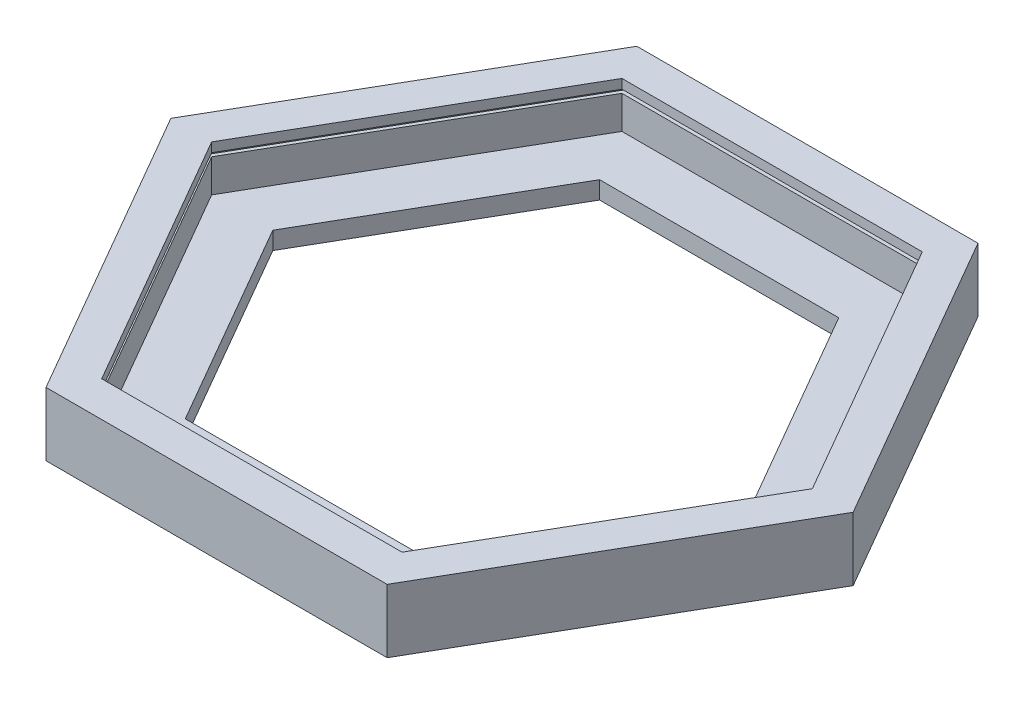
ISO-10303-21;
HEADER;
FILE_DESCRIPTION(('STEP AP214'),'2;1');
FILE_NAME('part.step','',(''),(''),'','','');
FILE_SCHEMA(('AUTOMOTIVE_DESIGN { 1 0 10303 214 1 1 1 1 }'));
ENDSEC;
DATA;
#1=APPLICATION_CONTEXT('core data for automotive mechanical design processes');
#2=APPLICATION_PROTOCOL_DEFINITION('international standard','automotive_design',2000,#1);
#3=PRODUCT_CONTEXT('',#1,'mechanical');
#4=PRODUCT('Part','Part','',(#3));
#5=PRODUCT_RELATED_PRODUCT_CATEGORY('part','',(#4));
#6=PRODUCT_DEFINITION_FORMATION('','',#4);
#7=PRODUCT_DEFINITION_CONTEXT('part definition',#1,'design');
#8=PRODUCT_DEFINITION('design','',#6,#7);
#9=PRODUCT_DEFINITION_SHAPE('','',#8);
#10=(LENGTH_UNIT() NAMED_UNIT(*) SI_UNIT(.MILLI.,.METRE.));
#11=(NAMED_UNIT(*) PLANE_ANGLE_UNIT() SI_UNIT($,.RADIAN.));
#12=(NAMED_UNIT(*) SI_UNIT($,.STERADIAN.) SOLID_ANGLE_UNIT());
#13=UNCERTAINTY_MEASURE_WITH_UNIT(LENGTH_MEASURE(1.E-05),#10,'distance_accuracy_value','');
#14=(GEOMETRIC_REPRESENTATION_CONTEXT(3) GLOBAL_UNCERTAINTY_ASSIGNED_CONTEXT((#13)) GLOBAL_UNIT_ASSIGNED_CONTEXT((#10,
#11,#12)) REPRESENTATION_CONTEXT('',''));
#15=CARTESIAN_POINT('',(0.,0.,0.));
#16=DIRECTION('',(0.,0.,1.));
#17=DIRECTION('',(1.,0.,0.));
#18=AXIS2_PLACEMENT_3D('',#15,#16,#17);
#19=CARTESIAN_POINT('',(-63.789419175,18.,36.8288383321362));
#20=DIRECTION('',(0.866025403784438,0.,-0.500000000000001));
#21=DIRECTION('',(-0.500000000000001,0.,-0.866025403784438));
#22=AXIS2_PLACEMENT_3D('',#19,#20,#21);
#23=PLANE('',#22);
#24=DIRECTION('',(0.,-1.,0.));
#25=VECTOR('',#24,1.);
#26=CARTESIAN_POINT('',(-85.0525589,18.,0.));
#27=LINE('',#26,#25);
#28=CARTESIAN_POINT('',(-85.0525589,14.35,0.));
#29=VERTEX_POINT('',#28);
#30=CARTESIAN_POINT('',(-85.0525589,5.,0.));
#31=VERTEX_POINT('',#30);
#32=EDGE_CURVE('E272',#29,#31,#27,.T.);
#33=ORIENTED_EDGE('',*,*,#32,.F.);
#34=DIRECTION('',(0.5,0.,0.866025403784439));
#35=VECTOR('',#34,1.);
#36=CARTESIAN_POINT('',(-85.0525589,14.35,0.));
#37=LINE('',#36,#35);
#38=CARTESIAN_POINT('',(-42.52627945,14.35,73.6576766642723));
#39=VERTEX_POINT('',#38);
#40=EDGE_CURVE('E479',#29,#39,#37,.T.);
#41=ORIENTED_EDGE('',*,*,#40,.T.);
#42=DIRECTION('',(0.,-1.,0.));
#43=VECTOR('',#42,1.);
#44=CARTESIAN_POINT('',(-42.5262794499999,18.,73.6576766642723));
#45=LINE('',#44,#43);
#46=CARTESIAN_POINT('',(-42.5262794499999,5.,73.6576766642723));
#47=VERTEX_POINT('',#46);
#48=EDGE_CURVE('E474',#39,#47,#45,.T.);
#49=ORIENTED_EDGE('',*,*,#48,.T.);
#50=DIRECTION('',(-0.500000000000001,0.,-0.866025403784438));
#51=VECTOR('',#50,1.);
#52=CARTESIAN_POINT('',(-63.789419175,5.,36.8288383321362));
#53=LINE('',#52,#51);
#54=EDGE_CURVE('E291',#47,#31,#53,.T.);
#55=ORIENTED_EDGE('',*,*,#54,.T.);
#56=EDGE_LOOP('',(#33,#41,#49,#55));
#57=FACE_BOUND('',#56,.T.);
#58=ADVANCED_FACE('F39',(#57),#23,.T.);
#59=CARTESIAN_POINT('',(-63.789419175,18.,-36.8288383321361));
#60=DIRECTION('',(0.866025403784439,0.,0.5));
#61=DIRECTION('',(0.5,0.,-0.866025403784439));
#62=AXIS2_PLACEMENT_3D('',#59,#60,#61);
#63=PLANE('',#62);
#64=DIRECTION('',(0.,-1.,0.));
#65=VECTOR('',#64,1.);
#66=CARTESIAN_POINT('',(-42.52627945,18.,-73.6576766642723));
#67=LINE('',#66,#65);
#68=CARTESIAN_POINT('',(-42.52627945,14.35,-73.6576766642723));
#69=VERTEX_POINT('',#68);
#70=CARTESIAN_POINT('',(-42.52627945,5.,-73.6576766642723));
#71=VERTEX_POINT('',#70);
#72=EDGE_CURVE('E268',#69,#71,#67,.T.);
#73=ORIENTED_EDGE('',*,*,#72,.F.);
#74=DIRECTION('',(-0.5,0.,0.866025403784439));
#75=VECTOR('',#74,1.);
#76=CARTESIAN_POINT('',(-42.52627945,14.35,-73.6576766642723));
#77=LINE('',#76,#75);
#78=EDGE_CURVE('E502',#69,#29,#77,.T.);
#79=ORIENTED_EDGE('',*,*,#78,.T.);
#80=ORIENTED_EDGE('',*,*,#32,.T.);
#81=DIRECTION('',(0.5,0.,-0.866025403784439));
#82=VECTOR('',#81,1.);
#83=CARTESIAN_POINT('',(-63.789419175,5.,-36.8288383321361));
#84=LINE('',#83,#82);
#85=EDGE_CURVE('E288',#31,#71,#84,.T.);
#86=ORIENTED_EDGE('',*,*,#85,.T.);
#87=EDGE_LOOP('',(#73,#79,#80,#86));
#88=FACE_BOUND('',#87,.T.);
#89=ADVANCED_FACE('F406',(#88),#63,.T.);
#90=CARTESIAN_POINT('',(0.,18.,-73.6576766642723));
#91=DIRECTION('',(0.,0.,1.));
#92=DIRECTION('',(1.,0.,0.));
#93=AXIS2_PLACEMENT_3D('',#90,#91,#92);
#94=PLANE('',#93);
#95=DIRECTION('',(0.,-1.,0.));
#96=VECTOR('',#95,1.);
#97=CARTESIAN_POINT('',(42.52627945,18.,-73.6576766642723));
#98=LINE('',#97,#96);
#99=CARTESIAN_POINT('',(42.52627945,14.35,-73.6576766642723));
#100=VERTEX_POINT('',#99);
#101=CARTESIAN_POINT('',(42.52627945,5.,-73.6576766642723));
#102=VERTEX_POINT('',#101);
#103=EDGE_CURVE('E260',#100,#102,#98,.T.);
#104=ORIENTED_EDGE('',*,*,#103,.F.);
#105=DIRECTION('',(-1.,0.,0.));
#106=VECTOR('',#105,1.);
#107=CARTESIAN_POINT('',(42.52627945,14.35,-73.6576766642723));
#108=LINE('',#107,#106);
#109=EDGE_CURVE('E499',#100,#69,#108,.T.);
#110=ORIENTED_EDGE('',*,*,#109,.T.);
#111=ORIENTED_EDGE('',*,*,#72,.T.);
#112=DIRECTION('',(1.,0.,0.));
#113=VECTOR('',#112,1.);
#114=CARTESIAN_POINT('',(0.,5.,-73.6576766642723));
#115=LINE('',#114,#113);
#116=EDGE_CURVE('E285',#71,#102,#115,.T.);
#117=ORIENTED_EDGE('',*,*,#116,.T.);
#118=EDGE_LOOP('',(#104,#110,#111,#117));
#119=FACE_BOUND('',#118,.T.);
#120=ADVANCED_FACE('F414',(#119),#94,.T.);
#121=CARTESIAN_POINT('',(63.789419175,18.,-36.8288383321362));
#122=DIRECTION('',(-0.866025403784438,0.,0.5));
#123=DIRECTION('',(0.5,0.,0.866025403784438));
#124=AXIS2_PLACEMENT_3D('',#121,#122,#123);
#125=PLANE('',#124);
#126=DIRECTION('',(0.,-1.,0.));
#127=VECTOR('',#126,1.);
#128=CARTESIAN_POINT('',(85.0525589,18.,0.));
#129=LINE('',#128,#127);
#130=CARTESIAN_POINT('',(85.0525589,14.35,0.));
#131=VERTEX_POINT('',#130);
#132=CARTESIAN_POINT('',(85.0525589,5.,0.));
#133=VERTEX_POINT('',#132);
#134=EDGE_CURVE('E261',#131,#133,#129,.T.);
#135=ORIENTED_EDGE('',*,*,#134,.F.);
#136=DIRECTION('',(-0.5,0.,-0.866025403784439));
#137=VECTOR('',#136,1.);
#138=CARTESIAN_POINT('',(85.0525589,14.35,0.));
#139=LINE('',#138,#137);
#140=EDGE_CURVE('E496',#131,#100,#139,.T.);
#141=ORIENTED_EDGE('',*,*,#140,.T.);
#142=ORIENTED_EDGE('',*,*,#103,.T.);
#143=DIRECTION('',(0.5,0.,0.866025403784438));
#144=VECTOR('',#143,1.);
#145=CARTESIAN_POINT('',(63.789419175,5.,-36.8288383321362));
#146=LINE('',#145,#144);
#147=EDGE_CURVE('E282',#102,#133,#146,.T.);
#148=ORIENTED_EDGE('',*,*,#147,.T.);
#149=EDGE_LOOP('',(#135,#141,#142,#148));
#150=FACE_BOUND('',#149,.T.);
#151=ADVANCED_FACE('F493',(#150),#125,.T.);
#152=CARTESIAN_POINT('',(63.789419175,18.,36.8288383321361));
#153=DIRECTION('',(-0.866025403784439,0.,-0.5));
#154=DIRECTION('',(-0.5,0.,0.866025403784439));
#155=AXIS2_PLACEMENT_3D('',#152,#153,#154);
#156=PLANE('',#155);
#157=DIRECTION('',(0.,-1.,0.));
#158=VECTOR('',#157,1.);
#159=CARTESIAN_POINT('',(42.52627945,18.,73.6576766642723));
#160=LINE('',#159,#158);
#161=CARTESIAN_POINT('',(42.52627945,14.35,73.6576766642723));
#162=VERTEX_POINT('',#161);
#163=CARTESIAN_POINT('',(42.52627945,5.,73.6576766642723));
#164=VERTEX_POINT('',#163);
#165=EDGE_CURVE('E475',#162,#164,#160,.T.);
#166=ORIENTED_EDGE('',*,*,#165,.F.);
#167=DIRECTION('',(0.5,0.,-0.866025403784439));
#168=VECTOR('',#167,1.);
#169=CARTESIAN_POINT('',(42.52627945,14.35,73.6576766642723));
#170=LINE('',#169,#168);
#171=EDGE_CURVE('E64',#162,#131,#170,.T.);
#172=ORIENTED_EDGE('',*,*,#171,.T.);
#173=ORIENTED_EDGE('',*,*,#134,.T.);
#174=DIRECTION('',(-0.5,0.,0.866025403784439));
#175=VECTOR('',#174,1.);
#176=CARTESIAN_POINT('',(63.789419175,5.,36.8288383321361));
#177=LINE('',#176,#175);
#178=EDGE_CURVE('E279',#133,#164,#177,.T.);
#179=ORIENTED_EDGE('',*,*,#178,.T.);
#180=EDGE_LOOP('',(#166,#172,#173,#179));
#181=FACE_BOUND('',#180,.T.);
#182=ADVANCED_FACE('F489',(#181),#156,.T.);
#183=CARTESIAN_POINT('',(0.,18.,73.6576766642723));
#184=DIRECTION('',(0.,0.,-1.));
#185=DIRECTION('',(-1.,0.,0.));
#186=AXIS2_PLACEMENT_3D('',#183,#184,#185);
#187=PLANE('',#186);
#188=ORIENTED_EDGE('',*,*,#48,.F.);
#189=DIRECTION('',(1.,0.,0.));
#190=VECTOR('',#189,1.);
#191=CARTESIAN_POINT('',(-42.52627945,14.35,73.6576766642723));
#192=LINE('',#191,#190);
#193=EDGE_CURVE('E245',#39,#162,#192,.T.);
#194=ORIENTED_EDGE('',*,*,#193,.T.);
#195=ORIENTED_EDGE('',*,*,#165,.T.);
#196=DIRECTION('',(-1.,0.,0.));
#197=VECTOR('',#196,1.);
#198=CARTESIAN_POINT('',(0.,5.,73.6576766642723));
#199=LINE('',#198,#197);
#200=EDGE_CURVE('E276',#164,#47,#199,.T.);
#201=ORIENTED_EDGE('',*,*,#200,.T.);
#202=EDGE_LOOP('',(#188,#194,#195,#201));
#203=FACE_BOUND('',#202,.T.);
#204=ADVANCED_FACE('F486',(#203),#187,.T.);
#205=CARTESIAN_POINT('',(-72.4496732128444,5.,-41.8288383321362));
#206=DIRECTION('',(0.866025403784439,0.,0.5));
#207=DIRECTION('',(0.5,0.,-0.866025403784439));
#208=AXIS2_PLACEMENT_3D('',#205,#206,#207);
#209=PLANE('',#208);
#210=DIRECTION('',(-0.5,0.,0.866025403784439));
#211=VECTOR('',#210,1.);
#212=CARTESIAN_POINT('',(-72.4496732128444,0.,-41.8288383321362));
#213=LINE('',#212,#211);
#214=CARTESIAN_POINT('',(-48.2997821418963,0.,-83.6576766642723));
#215=VERTEX_POINT('',#214);
#216=CARTESIAN_POINT('',(-96.5995642837926,0.,0.));
#217=VERTEX_POINT('',#216);
#218=EDGE_CURVE('E332',#215,#217,#213,.T.);
#219=ORIENTED_EDGE('',*,*,#218,.T.);
#220=DIRECTION('',(0.,-1.,0.));
#221=VECTOR('',#220,1.);
#222=CARTESIAN_POINT('',(-96.5995642837926,5.,0.));
#223=LINE('',#222,#221);
#224=CARTESIAN_POINT('',(-96.5995642837926,18.,0.));
#225=VERTEX_POINT('',#224);
#226=EDGE_CURVE('E11',#225,#217,#223,.T.);
#227=ORIENTED_EDGE('',*,*,#226,.F.);
#228=DIRECTION('',(-0.5,0.,0.866025403784439));
#229=VECTOR('',#228,1.);
#230=CARTESIAN_POINT('',(-72.4496732128444,18.,-41.8288383321362));
#231=LINE('',#230,#229);
#232=CARTESIAN_POINT('',(-48.2997821418963,18.,-83.6576766642723));
#233=VERTEX_POINT('',#232);
#234=EDGE_CURVE('E457',#233,#225,#231,.T.);
#235=ORIENTED_EDGE('',*,*,#234,.F.);
#236=DIRECTION('',(0.,-1.,0.));
#237=VECTOR('',#236,1.);
#238=CARTESIAN_POINT('',(-48.2997821418963,5.,-83.6576766642723));
#239=LINE('',#238,#237);
#240=EDGE_CURVE('E344',#233,#215,#239,.T.);
#241=ORIENTED_EDGE('',*,*,#240,.T.);
#242=EDGE_LOOP('',(#219,#227,#235,#241));
#243=FACE_BOUND('',#242,.T.);
#244=ADVANCED_FACE('F620',(#243),#209,.F.);
#245=CARTESIAN_POINT('',(-72.4496732128444,5.,41.8288383321361));
#246=DIRECTION('',(0.866025403784439,0.,-0.5));
#247=DIRECTION('',(-0.5,0.,-0.866025403784439));
#248=AXIS2_PLACEMENT_3D('',#245,#246,#247);
#249=PLANE('',#248);
#250=DIRECTION('',(0.5,0.,0.866025403784439));
#251=VECTOR('',#250,1.);
#252=CARTESIAN_POINT('',(-72.4496732128444,0.,41.8288383321361));
#253=LINE('',#252,#251);
#254=CARTESIAN_POINT('',(-48.2997821418963,0.,83.6576766642723));
#255=VERTEX_POINT('',#254);
#256=EDGE_CURVE('E335',#217,#255,#253,.T.);
#257=ORIENTED_EDGE('',*,*,#256,.T.);
#258=DIRECTION('',(0.,-1.,0.));
#259=VECTOR('',#258,1.);
#260=CARTESIAN_POINT('',(-48.2997821418963,5.,83.6576766642723));
#261=LINE('',#260,#259);
#262=CARTESIAN_POINT('',(-48.2997821418963,18.,83.6576766642723));
#263=VERTEX_POINT('',#262);
#264=EDGE_CURVE('E48',#263,#255,#261,.T.);
#265=ORIENTED_EDGE('',*,*,#264,.F.);
#266=DIRECTION('',(0.5,0.,0.866025403784439));
#267=VECTOR('',#266,1.);
#268=CARTESIAN_POINT('',(-72.4496732128444,18.,41.8288383321361));
#269=LINE('',#268,#267);
#270=EDGE_CURVE('E460',#225,#263,#269,.T.);
#271=ORIENTED_EDGE('',*,*,#270,.F.);
#272=ORIENTED_EDGE('',*,*,#226,.T.);
#273=EDGE_LOOP('',(#257,#265,#271,#272));
#274=FACE_BOUND('',#273,.T.);
#275=ADVANCED_FACE('F623',(#274),#249,.F.);
#276=CARTESIAN_POINT('',(0.,5.,83.6576766642723));
#277=DIRECTION('',(0.,0.,-1.));
#278=DIRECTION('',(-1.,0.,0.));
#279=AXIS2_PLACEMENT_3D('',#276,#277,#278);
#280=PLANE('',#279);
#281=DIRECTION('',(1.,0.,0.));
#282=VECTOR('',#281,1.);
#283=CARTESIAN_POINT('',(0.,0.,83.6576766642723));
#284=LINE('',#283,#282);
#285=CARTESIAN_POINT('',(48.2997821418963,0.,83.6576766642723));
#286=VERTEX_POINT('',#285);
#287=EDGE_CURVE('E337',#255,#286,#284,.T.);
#288=ORIENTED_EDGE('',*,*,#287,.T.);
#289=DIRECTION('',(0.,-1.,0.));
#290=VECTOR('',#289,1.);
#291=CARTESIAN_POINT('',(48.2997821418963,5.,83.6576766642723));
#292=LINE('',#291,#290);
#293=CARTESIAN_POINT('',(48.2997821418963,18.,83.6576766642723));
#294=VERTEX_POINT('',#293);
#295=EDGE_CURVE('E353',#294,#286,#292,.T.);
#296=ORIENTED_EDGE('',*,*,#295,.F.);
#297=DIRECTION('',(1.,0.,0.));
#298=VECTOR('',#297,1.);
#299=CARTESIAN_POINT('',(0.,18.,83.6576766642723));
#300=LINE('',#299,#298);
#301=EDGE_CURVE('E463',#263,#294,#300,.T.);
#302=ORIENTED_EDGE('',*,*,#301,.F.);
#303=ORIENTED_EDGE('',*,*,#264,.T.);
#304=EDGE_LOOP('',(#288,#296,#302,#303));
#305=FACE_BOUND('',#304,.T.);
#306=ADVANCED_FACE('F628',(#305),#280,.F.);
#307=CARTESIAN_POINT('',(72.4496732128444,5.,41.8288383321361));
#308=DIRECTION('',(-0.866025403784439,0.,-0.5));
#309=DIRECTION('',(-0.5,0.,0.866025403784439));
#310=AXIS2_PLACEMENT_3D('',#307,#308,#309);
#311=PLANE('',#310);
#312=DIRECTION('',(0.5,0.,-0.866025403784439));
#313=VECTOR('',#312,1.);
#314=CARTESIAN_POINT('',(72.4496732128444,0.,41.8288383321361));
#315=LINE('',#314,#313);
#316=CARTESIAN_POINT('',(96.5995642837926,0.,0.));
#317=VERTEX_POINT('',#316);
#318=EDGE_CURVE('E339',#286,#317,#315,.T.);
#319=ORIENTED_EDGE('',*,*,#318,.T.);
#320=DIRECTION('',(0.,-1.,0.));
#321=VECTOR('',#320,1.);
#322=CARTESIAN_POINT('',(96.5995642837926,5.,0.));
#323=LINE('',#322,#321);
#324=CARTESIAN_POINT('',(96.5995642837926,18.,0.));
#325=VERTEX_POINT('',#324);
#326=EDGE_CURVE('E350',#325,#317,#323,.T.);
#327=ORIENTED_EDGE('',*,*,#326,.F.);
#328=DIRECTION('',(0.5,0.,-0.866025403784439));
#329=VECTOR('',#328,1.);
#330=CARTESIAN_POINT('',(72.4496732128444,18.,41.8288383321361));
#331=LINE('',#330,#329);
#332=EDGE_CURVE('E466',#294,#325,#331,.T.);
#333=ORIENTED_EDGE('',*,*,#332,.F.);
#334=ORIENTED_EDGE('',*,*,#295,.T.);
#335=EDGE_LOOP('',(#319,#327,#333,#334));
#336=FACE_BOUND('',#335,.T.);
#337=ADVANCED_FACE('F634',(#336),#311,.F.);
#338=CARTESIAN_POINT('',(72.4496732128444,5.,-41.8288383321361));
#339=DIRECTION('',(-0.866025403784439,0.,0.5));
#340=DIRECTION('',(0.5,0.,0.866025403784439));
#341=AXIS2_PLACEMENT_3D('',#338,#339,#340);
#342=PLANE('',#341);
#343=DIRECTION('',(-0.5,0.,-0.866025403784439));
#344=VECTOR('',#343,1.);
#345=CARTESIAN_POINT('',(72.4496732128444,0.,-41.8288383321361));
#346=LINE('',#345,#344);
#347=CARTESIAN_POINT('',(48.2997821418963,0.,-83.6576766642723));
#348=VERTEX_POINT('',#347);
#349=EDGE_CURVE('E341',#317,#348,#346,.T.);
#350=ORIENTED_EDGE('',*,*,#349,.T.);
#351=DIRECTION('',(0.,-1.,0.));
#352=VECTOR('',#351,1.);
#353=CARTESIAN_POINT('',(48.2997821418963,5.,-83.6576766642723));
#354=LINE('',#353,#352);
#355=CARTESIAN_POINT('',(48.2997821418963,18.,-83.6576766642723));
#356=VERTEX_POINT('',#355);
#357=EDGE_CURVE('E347',#356,#348,#354,.T.);
#358=ORIENTED_EDGE('',*,*,#357,.F.);
#359=DIRECTION('',(-0.5,0.,-0.866025403784439));
#360=VECTOR('',#359,1.);
#361=CARTESIAN_POINT('',(72.4496732128444,18.,-41.8288383321361));
#362=LINE('',#361,#360);
#363=EDGE_CURVE('E469',#325,#356,#362,.T.);
#364=ORIENTED_EDGE('',*,*,#363,.F.);
#365=ORIENTED_EDGE('',*,*,#326,.T.);
#366=EDGE_LOOP('',(#350,#358,#364,#365));
#367=FACE_BOUND('',#366,.T.);
#368=ADVANCED_FACE('F638',(#367),#342,.F.);
#369=CARTESIAN_POINT('',(50.7990381182334,5.,-29.3288383321362));
#370=DIRECTION('',(-0.866025403784438,0.,0.5));
#371=DIRECTION('',(0.5,0.,0.866025403784438));
#372=AXIS2_PLACEMENT_3D('',#369,#370,#371);
#373=PLANE('',#372);
#374=DIRECTION('',(-0.5,0.,-0.866025403784439));
#375=VECTOR('',#374,1.);
#376=CARTESIAN_POINT('',(50.7990381182334,0.,-29.3288383321362));
#377=LINE('',#376,#375);
#378=CARTESIAN_POINT('',(67.7320508243113,0.,0.));
#379=VERTEX_POINT('',#378);
#380=CARTESIAN_POINT('',(33.8660254121556,0.,-58.6576766642723));
#381=VERTEX_POINT('',#380);
#382=EDGE_CURVE('E294',#379,#381,#377,.T.);
#383=ORIENTED_EDGE('',*,*,#382,.F.);
#384=DIRECTION('',(0.,-1.,0.));
#385=VECTOR('',#384,1.);
#386=CARTESIAN_POINT('',(67.7320508243113,5.,0.));
#387=LINE('',#386,#385);
#388=CARTESIAN_POINT('',(67.7320508243113,5.,0.));
#389=VERTEX_POINT('',#388);
#390=EDGE_CURVE('E43',#389,#379,#387,.T.);
#391=ORIENTED_EDGE('',*,*,#390,.F.);
#392=DIRECTION('',(-0.5,0.,-0.866025403784439));
#393=VECTOR('',#392,1.);
#394=CARTESIAN_POINT('',(50.7990381182334,5.,-29.3288383321362));
#395=LINE('',#394,#393);
#396=CARTESIAN_POINT('',(33.8660254121556,5.,-58.6576766642723));
#397=VERTEX_POINT('',#396);
#398=EDGE_CURVE('E295',#389,#397,#395,.T.);
#399=ORIENTED_EDGE('',*,*,#398,.T.);
#400=DIRECTION('',(0.,-1.,0.));
#401=VECTOR('',#400,1.);
#402=CARTESIAN_POINT('',(33.8660254121556,5.,-58.6576766642723));
#403=LINE('',#402,#401);
#404=EDGE_CURVE('E314',#397,#381,#403,.T.);
#405=ORIENTED_EDGE('',*,*,#404,.T.);
#406=EDGE_LOOP('',(#383,#391,#399,#405));
#407=FACE_BOUND('',#406,.T.);
#408=ADVANCED_FACE('F41',(#407),#373,.T.);
#409=CARTESIAN_POINT('',(50.7990381182334,5.,29.3288383321361));
#410=DIRECTION('',(-0.866025403784439,0.,-0.5));
#411=DIRECTION('',(-0.5,0.,0.866025403784439));
#412=AXIS2_PLACEMENT_3D('',#409,#410,#411);
#413=PLANE('',#412);
#414=DIRECTION('',(0.5,0.,-0.866025403784439));
#415=VECTOR('',#414,1.);
#416=CARTESIAN_POINT('',(50.7990381182334,0.,29.3288383321361));
#417=LINE('',#416,#415);
#418=CARTESIAN_POINT('',(33.8660254121556,0.,58.6576766642723));
#419=VERTEX_POINT('',#418);
#420=EDGE_CURVE('E317',#419,#379,#417,.T.);
#421=ORIENTED_EDGE('',*,*,#420,.F.);
#422=DIRECTION('',(0.,-1.,0.));
#423=VECTOR('',#422,1.);
#424=CARTESIAN_POINT('',(33.8660254121556,5.,58.6576766642723));
#425=LINE('',#424,#423);
#426=CARTESIAN_POINT('',(33.8660254121556,5.,58.6576766642723));
#427=VERTEX_POINT('',#426);
#428=EDGE_CURVE('E364',#427,#419,#425,.T.);
#429=ORIENTED_EDGE('',*,*,#428,.F.);
#430=DIRECTION('',(0.5,0.,-0.866025403784439));
#431=VECTOR('',#430,1.);
#432=CARTESIAN_POINT('',(50.7990381182334,5.,29.3288383321361));
#433=LINE('',#432,#431);
#434=EDGE_CURVE('E298',#427,#389,#433,.T.);
#435=ORIENTED_EDGE('',*,*,#434,.T.);
#436=ORIENTED_EDGE('',*,*,#390,.T.);
#437=EDGE_LOOP('',(#421,#429,#435,#436));
#438=FACE_BOUND('',#437,.T.);
#439=ADVANCED_FACE('F370',(#438),#413,.T.);
#440=CARTESIAN_POINT('',(0.,5.,58.6576766642723));
#441=DIRECTION('',(0.,0.,-1.));
#442=DIRECTION('',(-1.,0.,0.));
#443=AXIS2_PLACEMENT_3D('',#440,#441,#442);
#444=PLANE('',#443);
#445=DIRECTION('',(1.,0.,0.));
#446=VECTOR('',#445,1.);
#447=CARTESIAN_POINT('',(0.,0.,58.6576766642723));
#448=LINE('',#447,#446);
#449=CARTESIAN_POINT('',(-33.8660254121556,0.,58.6576766642723));
#450=VERTEX_POINT('',#449);
#451=EDGE_CURVE('E320',#450,#419,#448,.T.);
#452=ORIENTED_EDGE('',*,*,#451,.F.);
#453=DIRECTION('',(0.,-1.,0.));
#454=VECTOR('',#453,1.);
#455=CARTESIAN_POINT('',(-33.8660254121556,5.,58.6576766642723));
#456=LINE('',#455,#454);
#457=CARTESIAN_POINT('',(-33.8660254121556,5.,58.6576766642723));
#458=VERTEX_POINT('',#457);
#459=EDGE_CURVE('E363',#458,#450,#456,.T.);
#460=ORIENTED_EDGE('',*,*,#459,.F.);
#461=DIRECTION('',(1.,0.,0.));
#462=VECTOR('',#461,1.);
#463=CARTESIAN_POINT('',(0.,5.,58.6576766642723));
#464=LINE('',#463,#462);
#465=EDGE_CURVE('E302',#458,#427,#464,.T.);
#466=ORIENTED_EDGE('',*,*,#465,.T.);
#467=ORIENTED_EDGE('',*,*,#428,.T.);
#468=EDGE_LOOP('',(#452,#460,#466,#467));
#469=FACE_BOUND('',#468,.T.);
#470=ADVANCED_FACE('F379',(#469),#444,.T.);
#471=CARTESIAN_POINT('',(-50.7990381182334,5.,29.3288383321362));
#472=DIRECTION('',(0.866025403784439,0.,-0.5));
#473=DIRECTION('',(-0.5,0.,-0.866025403784439));
#474=AXIS2_PLACEMENT_3D('',#471,#472,#473);
#475=PLANE('',#474);
#476=DIRECTION('',(0.5,0.,0.866025403784439));
#477=VECTOR('',#476,1.);
#478=CARTESIAN_POINT('',(-50.7990381182334,0.,29.3288383321362));
#479=LINE('',#478,#477);
#480=CARTESIAN_POINT('',(-67.7320508243113,0.,0.));
#481=VERTEX_POINT('',#480);
#482=EDGE_CURVE('E323',#481,#450,#479,.T.);
#483=ORIENTED_EDGE('',*,*,#482,.F.);
#484=DIRECTION('',(0.,-1.,0.));
#485=VECTOR('',#484,1.);
#486=CARTESIAN_POINT('',(-67.7320508243113,5.,0.));
#487=LINE('',#486,#485);
#488=CARTESIAN_POINT('',(-67.7320508243113,5.,0.));
#489=VERTEX_POINT('',#488);
#490=EDGE_CURVE('E361',#489,#481,#487,.T.);
#491=ORIENTED_EDGE('',*,*,#490,.F.);
#492=DIRECTION('',(0.5,0.,0.866025403784439));
#493=VECTOR('',#492,1.);
#494=CARTESIAN_POINT('',(-50.7990381182334,5.,29.3288383321362));
#495=LINE('',#494,#493);
#496=EDGE_CURVE('E305',#489,#458,#495,.T.);
#497=ORIENTED_EDGE('',*,*,#496,.T.);
#498=ORIENTED_EDGE('',*,*,#459,.T.);
#499=EDGE_LOOP('',(#483,#491,#497,#498));
#500=FACE_BOUND('',#499,.T.);
#501=ADVANCED_FACE('F386',(#500),#475,.T.);
#502=CARTESIAN_POINT('',(-50.7990381182334,5.,-29.3288383321361));
#503=DIRECTION('',(0.866025403784439,0.,0.5));
#504=DIRECTION('',(0.5,0.,-0.866025403784439));
#505=AXIS2_PLACEMENT_3D('',#502,#503,#504);
#506=PLANE('',#505);
#507=DIRECTION('',(-0.5,0.,0.866025403784439));
#508=VECTOR('',#507,1.);
#509=CARTESIAN_POINT('',(-50.7990381182334,0.,-29.3288383321361));
#510=LINE('',#509,#508);
#511=CARTESIAN_POINT('',(-33.8660254121556,0.,-58.6576766642723));
#512=VERTEX_POINT('',#511);
#513=EDGE_CURVE('E326',#512,#481,#510,.T.);
#514=ORIENTED_EDGE('',*,*,#513,.F.);
#515=DIRECTION('',(0.,-1.,0.));
#516=VECTOR('',#515,1.);
#517=CARTESIAN_POINT('',(-33.8660254121556,5.,-58.6576766642723));
#518=LINE('',#517,#516);
#519=CARTESIAN_POINT('',(-33.8660254121556,5.,-58.6576766642723));
#520=VERTEX_POINT('',#519);
#521=EDGE_CURVE('E359',#520,#512,#518,.T.);
#522=ORIENTED_EDGE('',*,*,#521,.F.);
#523=DIRECTION('',(-0.5,0.,0.866025403784439));
#524=VECTOR('',#523,1.);
#525=CARTESIAN_POINT('',(-50.7990381182334,5.,-29.3288383321361));
#526=LINE('',#525,#524);
#527=EDGE_CURVE('E308',#520,#489,#526,.T.);
#528=ORIENTED_EDGE('',*,*,#527,.T.);
#529=ORIENTED_EDGE('',*,*,#490,.T.);
#530=EDGE_LOOP('',(#514,#522,#528,#529));
#531=FACE_BOUND('',#530,.T.);
#532=ADVANCED_FACE('F389',(#531),#506,.T.);
#533=CARTESIAN_POINT('',(0.,5.,-58.6576766642723));
#534=DIRECTION('',(0.,0.,1.));
#535=DIRECTION('',(1.,0.,0.));
#536=AXIS2_PLACEMENT_3D('',#533,#534,#535);
#537=PLANE('',#536);
#538=DIRECTION('',(-1.,0.,0.));
#539=VECTOR('',#538,1.);
#540=CARTESIAN_POINT('',(0.,0.,-58.6576766642723));
#541=LINE('',#540,#539);
#542=EDGE_CURVE('E329',#381,#512,#541,.T.);
#543=ORIENTED_EDGE('',*,*,#542,.F.);
#544=ORIENTED_EDGE('',*,*,#404,.F.);
#545=DIRECTION('',(-1.,0.,0.));
#546=VECTOR('',#545,1.);
#547=CARTESIAN_POINT('',(0.,5.,-58.6576766642723));
#548=LINE('',#547,#546);
#549=EDGE_CURVE('E311',#397,#520,#548,.T.);
#550=ORIENTED_EDGE('',*,*,#549,.T.);
#551=ORIENTED_EDGE('',*,*,#521,.T.);
#552=EDGE_LOOP('',(#543,#544,#550,#551));
#553=FACE_BOUND('',#552,.T.);
#554=ADVANCED_FACE('F392',(#553),#537,.T.);
#555=CARTESIAN_POINT('',(0.,5.,-83.6576766642723));
#556=DIRECTION('',(0.,0.,1.));
#557=DIRECTION('',(1.,0.,0.));
#558=AXIS2_PLACEMENT_3D('',#555,#556,#557);
#559=PLANE('',#558);
#560=DIRECTION('',(-1.,0.,0.));
#561=VECTOR('',#560,1.);
#562=CARTESIAN_POINT('',(0.,0.,-83.6576766642723));
#563=LINE('',#562,#561);
#564=EDGE_CURVE('E299',#348,#215,#563,.T.);
#565=ORIENTED_EDGE('',*,*,#564,.T.);
#566=ORIENTED_EDGE('',*,*,#240,.F.);
#567=DIRECTION('',(-1.,0.,0.));
#568=VECTOR('',#567,1.);
#569=CARTESIAN_POINT('',(0.,18.,-83.6576766642723));
#570=LINE('',#569,#568);
#571=EDGE_CURVE('E472',#356,#233,#570,.T.);
#572=ORIENTED_EDGE('',*,*,#571,.F.);
#573=ORIENTED_EDGE('',*,*,#357,.T.);
#574=EDGE_LOOP('',(#565,#566,#572,#573));
#575=FACE_BOUND('',#574,.T.);
#576=ADVANCED_FACE('F394',(#575),#559,.F.);
#577=CARTESIAN_POINT('',(0.,5.,0.));
#578=DIRECTION('',(0.,1.,0.));
#579=DIRECTION('',(0.,0.,1.));
#580=AXIS2_PLACEMENT_3D('',#577,#578,#579);
#581=PLANE('',#580);
#582=ORIENTED_EDGE('',*,*,#54,.F.);
#583=ORIENTED_EDGE('',*,*,#200,.F.);
#584=ORIENTED_EDGE('',*,*,#178,.F.);
#585=ORIENTED_EDGE('',*,*,#147,.F.);
#586=ORIENTED_EDGE('',*,*,#116,.F.);
#587=ORIENTED_EDGE('',*,*,#85,.F.);
#588=EDGE_LOOP('',(#582,#583,#584,#585,#586,#587));
#589=FACE_BOUND('',#588,.T.);
#590=ORIENTED_EDGE('',*,*,#398,.F.);
#591=ORIENTED_EDGE('',*,*,#434,.F.);
#592=ORIENTED_EDGE('',*,*,#465,.F.);
#593=ORIENTED_EDGE('',*,*,#496,.F.);
#594=ORIENTED_EDGE('',*,*,#527,.F.);
#595=ORIENTED_EDGE('',*,*,#549,.F.);
#596=EDGE_LOOP('',(#590,#591,#592,#593,#594,#595));
#597=FACE_BOUND('',#596,.T.);
#598=ADVANCED_FACE('F384',(#589,#597),#581,.T.);
#599=CARTESIAN_POINT('',(0.,0.,0.));
#600=DIRECTION('',(0.,1.,0.));
#601=DIRECTION('',(0.,0.,1.));
#602=AXIS2_PLACEMENT_3D('',#599,#600,#601);
#603=PLANE('',#602);
#604=ORIENTED_EDGE('',*,*,#382,.T.);
#605=ORIENTED_EDGE('',*,*,#542,.T.);
#606=ORIENTED_EDGE('',*,*,#513,.T.);
#607=ORIENTED_EDGE('',*,*,#482,.T.);
#608=ORIENTED_EDGE('',*,*,#451,.T.);
#609=ORIENTED_EDGE('',*,*,#420,.T.);
#610=EDGE_LOOP('',(#604,#605,#606,#607,#608,#609));
#611=FACE_BOUND('',#610,.T.);
#612=ORIENTED_EDGE('',*,*,#218,.F.);
#613=ORIENTED_EDGE('',*,*,#564,.F.);
#614=ORIENTED_EDGE('',*,*,#349,.F.);
#615=ORIENTED_EDGE('',*,*,#318,.F.);
#616=ORIENTED_EDGE('',*,*,#287,.F.);
#617=ORIENTED_EDGE('',*,*,#256,.F.);
#618=EDGE_LOOP('',(#612,#613,#614,#615,#616,#617));
#619=FACE_BOUND('',#618,.T.);
#620=ADVANCED_FACE('F376',(#611,#619),#603,.F.);
#621=DIRECTION('',(0.5,0.,0.866025403784439));
#622=VECTOR('',#621,1.);
#623=CARTESIAN_POINT('',(-85.0525589,15.35,0.));
#624=LINE('',#623,#622);
#625=CARTESIAN_POINT('',(-85.0525589,15.35,0.));
#626=VERTEX_POINT('',#625);
#627=CARTESIAN_POINT('',(-42.5262794499999,15.35,73.6576766642723));
#628=VERTEX_POINT('',#627);
#629=EDGE_CURVE('E56',#626,#628,#624,.T.);
#630=ORIENTED_EDGE('',*,*,#629,.F.);
#631=CARTESIAN_POINT('',(-85.0525589,18.,0.));
#632=VERTEX_POINT('',#631);
#633=EDGE_CURVE('E273',#632,#626,#27,.T.);
#634=ORIENTED_EDGE('',*,*,#633,.F.);
#635=DIRECTION('',(0.500000000000001,0.,0.866025403784438));
#636=VECTOR('',#635,1.);
#637=CARTESIAN_POINT('',(-63.789419175,18.,36.8288383321362));
#638=LINE('',#637,#636);
#639=CARTESIAN_POINT('',(-42.5262794499999,18.,73.6576766642723));
#640=VERTEX_POINT('',#639);
#641=EDGE_CURVE('E444',#632,#640,#638,.T.);
#642=ORIENTED_EDGE('',*,*,#641,.T.);
#643=EDGE_CURVE('E433',#640,#628,#45,.T.);
#644=ORIENTED_EDGE('',*,*,#643,.T.);
#645=EDGE_LOOP('',(#630,#634,#642,#644));
#646=FACE_BOUND('',#645,.T.);
#647=ADVANCED_FACE('F409',(#646),#23,.T.);
#648=DIRECTION('',(-0.5,0.,0.866025403784439));
#649=VECTOR('',#648,1.);
#650=CARTESIAN_POINT('',(-42.52627945,15.35,-73.6576766642723));
#651=LINE('',#650,#649);
#652=CARTESIAN_POINT('',(-42.52627945,15.35,-73.6576766642723));
#653=VERTEX_POINT('',#652);
#654=EDGE_CURVE('E434',#653,#626,#651,.T.);
#655=ORIENTED_EDGE('',*,*,#654,.F.);
#656=CARTESIAN_POINT('',(-42.52627945,18.,-73.6576766642723));
#657=VERTEX_POINT('',#656);
#658=EDGE_CURVE('E269',#657,#653,#67,.T.);
#659=ORIENTED_EDGE('',*,*,#658,.F.);
#660=DIRECTION('',(-0.5,0.,0.866025403784439));
#661=VECTOR('',#660,1.);
#662=CARTESIAN_POINT('',(-63.789419175,18.,-36.8288383321361));
#663=LINE('',#662,#661);
#664=EDGE_CURVE('E439',#657,#632,#663,.T.);
#665=ORIENTED_EDGE('',*,*,#664,.T.);
#666=ORIENTED_EDGE('',*,*,#633,.T.);
#667=EDGE_LOOP('',(#655,#659,#665,#666));
#668=FACE_BOUND('',#667,.T.);
#669=ADVANCED_FACE('F417',(#668),#63,.T.);
#670=DIRECTION('',(-1.,0.,0.));
#671=VECTOR('',#670,1.);
#672=CARTESIAN_POINT('',(42.52627945,15.35,-73.6576766642723));
#673=LINE('',#672,#671);
#674=CARTESIAN_POINT('',(42.52627945,15.35,-73.6576766642723));
#675=VERTEX_POINT('',#674);
#676=EDGE_CURVE('E254',#675,#653,#673,.T.);
#677=ORIENTED_EDGE('',*,*,#676,.F.);
#678=CARTESIAN_POINT('',(42.52627945,18.,-73.6576766642723));
#679=VERTEX_POINT('',#678);
#680=EDGE_CURVE('E253',#679,#675,#98,.T.);
#681=ORIENTED_EDGE('',*,*,#680,.F.);
#682=DIRECTION('',(-1.,0.,0.));
#683=VECTOR('',#682,1.);
#684=CARTESIAN_POINT('',(0.,18.,-73.6576766642723));
#685=LINE('',#684,#683);
#686=EDGE_CURVE('E443',#679,#657,#685,.T.);
#687=ORIENTED_EDGE('',*,*,#686,.T.);
#688=ORIENTED_EDGE('',*,*,#658,.T.);
#689=EDGE_LOOP('',(#677,#681,#687,#688));
#690=FACE_BOUND('',#689,.T.);
#691=ADVANCED_FACE('F426',(#690),#94,.T.);
#692=DIRECTION('',(-0.5,0.,-0.866025403784439));
#693=VECTOR('',#692,1.);
#694=CARTESIAN_POINT('',(85.0525589,15.35,0.));
#695=LINE('',#694,#693);
#696=CARTESIAN_POINT('',(85.0525589,15.35,0.));
#697=VERTEX_POINT('',#696);
#698=EDGE_CURVE('E239',#697,#675,#695,.T.);
#699=ORIENTED_EDGE('',*,*,#698,.F.);
#700=CARTESIAN_POINT('',(85.0525589,18.,0.));
#701=VERTEX_POINT('',#700);
#702=EDGE_CURVE('E251',#701,#697,#129,.T.);
#703=ORIENTED_EDGE('',*,*,#702,.F.);
#704=DIRECTION('',(-0.5,0.,-0.866025403784438));
#705=VECTOR('',#704,1.);
#706=CARTESIAN_POINT('',(63.789419175,18.,-36.8288383321362));
#707=LINE('',#706,#705);
#708=EDGE_CURVE('E446',#701,#679,#707,.T.);
#709=ORIENTED_EDGE('',*,*,#708,.T.);
#710=ORIENTED_EDGE('',*,*,#680,.T.);
#711=EDGE_LOOP('',(#699,#703,#709,#710));
#712=FACE_BOUND('',#711,.T.);
#713=ADVANCED_FACE('F249',(#712),#125,.T.);
#714=DIRECTION('',(0.5,0.,-0.866025403784439));
#715=VECTOR('',#714,1.);
#716=CARTESIAN_POINT('',(42.52627945,15.35,73.6576766642723));
#717=LINE('',#716,#715);
#718=CARTESIAN_POINT('',(42.52627945,15.35,73.6576766642723));
#719=VERTEX_POINT('',#718);
#720=EDGE_CURVE('E236',#719,#697,#717,.T.);
#721=ORIENTED_EDGE('',*,*,#720,.F.);
#722=CARTESIAN_POINT('',(42.52627945,18.,73.6576766642723));
#723=VERTEX_POINT('',#722);
#724=EDGE_CURVE('E264',#723,#719,#160,.T.);
#725=ORIENTED_EDGE('',*,*,#724,.F.);
#726=DIRECTION('',(0.5,0.,-0.866025403784439));
#727=VECTOR('',#726,1.);
#728=CARTESIAN_POINT('',(63.789419175,18.,36.8288383321361));
#729=LINE('',#728,#727);
#730=EDGE_CURVE('E259',#723,#701,#729,.T.);
#731=ORIENTED_EDGE('',*,*,#730,.T.);
#732=ORIENTED_EDGE('',*,*,#702,.T.);
#733=EDGE_LOOP('',(#721,#725,#731,#732));
#734=FACE_BOUND('',#733,.T.);
#735=ADVANCED_FACE('F257',(#734),#156,.T.);
#736=DIRECTION('',(1.,0.,0.));
#737=VECTOR('',#736,1.);
#738=CARTESIAN_POINT('',(-42.52627945,15.35,73.6576766642723));
#739=LINE('',#738,#737);
#740=EDGE_CURVE('E241',#628,#719,#739,.T.);
#741=ORIENTED_EDGE('',*,*,#740,.F.);
#742=ORIENTED_EDGE('',*,*,#643,.F.);
#743=DIRECTION('',(1.,0.,0.));
#744=VECTOR('',#743,1.);
#745=CARTESIAN_POINT('',(0.,18.,73.6576766642723));
#746=LINE('',#745,#744);
#747=EDGE_CURVE('E454',#640,#723,#746,.T.);
#748=ORIENTED_EDGE('',*,*,#747,.T.);
#749=ORIENTED_EDGE('',*,*,#724,.T.);
#750=EDGE_LOOP('',(#741,#742,#748,#749));
#751=FACE_BOUND('',#750,.T.);
#752=ADVANCED_FACE('F599',(#751),#187,.T.);
#753=CARTESIAN_POINT('',(0.,18.,0.));
#754=DIRECTION('',(0.,1.,0.));
#755=DIRECTION('',(0.,0.,1.));
#756=AXIS2_PLACEMENT_3D('',#753,#754,#755);
#757=PLANE('',#756);
#758=ORIENTED_EDGE('',*,*,#641,.F.);
#759=ORIENTED_EDGE('',*,*,#664,.F.);
#760=ORIENTED_EDGE('',*,*,#686,.F.);
#761=ORIENTED_EDGE('',*,*,#708,.F.);
#762=ORIENTED_EDGE('',*,*,#730,.F.);
#763=ORIENTED_EDGE('',*,*,#747,.F.);
#764=EDGE_LOOP('',(#758,#759,#760,#761,#762,#763));
#765=FACE_BOUND('',#764,.T.);
#766=ORIENTED_EDGE('',*,*,#234,.T.);
#767=ORIENTED_EDGE('',*,*,#270,.T.);
#768=ORIENTED_EDGE('',*,*,#301,.T.);
#769=ORIENTED_EDGE('',*,*,#332,.T.);
#770=ORIENTED_EDGE('',*,*,#363,.T.);
#771=ORIENTED_EDGE('',*,*,#571,.T.);
#772=EDGE_LOOP('',(#766,#767,#768,#769,#770,#771));
#773=FACE_BOUND('',#772,.T.);
#774=ADVANCED_FACE('F597',(#765,#773),#757,.T.);
#775=CARTESIAN_POINT('',(0.,15.35,0.));
#776=DIRECTION('',(0.,1.,0.));
#777=DIRECTION('',(0.,0.,1.));
#778=AXIS2_PLACEMENT_3D('',#775,#776,#777);
#779=PLANE('',#778);
#780=DIRECTION('',(0.5,0.,-0.866025403784439));
#781=VECTOR('',#780,1.);
#782=CARTESIAN_POINT('',(43.1036297191896,15.35,74.6576766642723));
#783=LINE('',#782,#781);
#784=CARTESIAN_POINT('',(43.1036297191896,15.35,74.6576766642723));
#785=VERTEX_POINT('',#784);
#786=CARTESIAN_POINT('',(86.2072594383793,15.35,0.));
#787=VERTEX_POINT('',#786);
#788=EDGE_CURVE('E509',#785,#787,#783,.T.);
#789=ORIENTED_EDGE('',*,*,#788,.F.);
#790=DIRECTION('',(1.,0.,0.));
#791=VECTOR('',#790,1.);
#792=CARTESIAN_POINT('',(-43.1036297191896,15.35,74.6576766642723));
#793=LINE('',#792,#791);
#794=CARTESIAN_POINT('',(-43.1036297191896,15.35,74.6576766642723));
#795=VERTEX_POINT('',#794);
#796=EDGE_CURVE('E521',#795,#785,#793,.T.);
#797=ORIENTED_EDGE('',*,*,#796,.F.);
#798=DIRECTION('',(0.5,0.,0.866025403784438));
#799=VECTOR('',#798,1.);
#800=CARTESIAN_POINT('',(-86.2072594383793,15.35,0.));
#801=LINE('',#800,#799);
#802=CARTESIAN_POINT('',(-86.2072594383793,15.35,0.));
#803=VERTEX_POINT('',#802);
#804=EDGE_CURVE('E519',#803,#795,#801,.T.);
#805=ORIENTED_EDGE('',*,*,#804,.F.);
#806=DIRECTION('',(-0.5,0.,0.866025403784439));
#807=VECTOR('',#806,1.);
#808=CARTESIAN_POINT('',(-43.1036297191896,15.35,-74.6576766642723));
#809=LINE('',#808,#807);
#810=CARTESIAN_POINT('',(-43.1036297191896,15.35,-74.6576766642723));
#811=VERTEX_POINT('',#810);
#812=EDGE_CURVE('E517',#811,#803,#809,.T.);
#813=ORIENTED_EDGE('',*,*,#812,.F.);
#814=DIRECTION('',(-1.,0.,0.));
#815=VECTOR('',#814,1.);
#816=CARTESIAN_POINT('',(43.1036297191896,15.35,-74.6576766642723));
#817=LINE('',#816,#815);
#818=CARTESIAN_POINT('',(43.1036297191896,15.35,-74.6576766642723));
#819=VERTEX_POINT('',#818);
#820=EDGE_CURVE('E515',#819,#811,#817,.T.);
#821=ORIENTED_EDGE('',*,*,#820,.F.);
#822=DIRECTION('',(-0.5,0.,-0.866025403784438));
#823=VECTOR('',#822,1.);
#824=CARTESIAN_POINT('',(86.2072594383793,15.35,0.));
#825=LINE('',#824,#823);
#826=EDGE_CURVE('E512',#787,#819,#825,.T.);
#827=ORIENTED_EDGE('',*,*,#826,.F.);
#828=EDGE_LOOP('',(#789,#797,#805,#813,#821,#827));
#829=FACE_BOUND('',#828,.T.);
#830=ORIENTED_EDGE('',*,*,#698,.T.);
#831=ORIENTED_EDGE('',*,*,#676,.T.);
#832=ORIENTED_EDGE('',*,*,#654,.T.);
#833=ORIENTED_EDGE('',*,*,#629,.T.);
#834=ORIENTED_EDGE('',*,*,#740,.T.);
#835=ORIENTED_EDGE('',*,*,#720,.T.);
#836=EDGE_LOOP('',(#830,#831,#832,#833,#834,#835));
#837=FACE_BOUND('',#836,.T.);
#838=ADVANCED_FACE('F238',(#829,#837),#779,.F.);
#839=CARTESIAN_POINT('',(0.,14.35,0.));
#840=DIRECTION('',(0.,1.,0.));
#841=DIRECTION('',(0.,0.,1.));
#842=AXIS2_PLACEMENT_3D('',#839,#840,#841);
#843=PLANE('',#842);
#844=DIRECTION('',(0.5,0.,-0.866025403784439));
#845=VECTOR('',#844,1.);
#846=CARTESIAN_POINT('',(43.1036297191896,14.35,74.6576766642723));
#847=LINE('',#846,#845);
#848=CARTESIAN_POINT('',(43.1036297191896,14.35,74.6576766642723));
#849=VERTEX_POINT('',#848);
#850=CARTESIAN_POINT('',(86.2072594383793,14.35,0.));
#851=VERTEX_POINT('',#850);
#852=EDGE_CURVE('E524',#849,#851,#847,.T.);
#853=ORIENTED_EDGE('',*,*,#852,.T.);
#854=DIRECTION('',(-0.5,0.,-0.866025403784438));
#855=VECTOR('',#854,1.);
#856=CARTESIAN_POINT('',(86.2072594383793,14.35,0.));
#857=LINE('',#856,#855);
#858=CARTESIAN_POINT('',(43.1036297191896,14.35,-74.6576766642723));
#859=VERTEX_POINT('',#858);
#860=EDGE_CURVE('E527',#851,#859,#857,.T.);
#861=ORIENTED_EDGE('',*,*,#860,.T.);
#862=DIRECTION('',(-1.,0.,0.));
#863=VECTOR('',#862,1.);
#864=CARTESIAN_POINT('',(43.1036297191896,14.35,-74.6576766642723));
#865=LINE('',#864,#863);
#866=CARTESIAN_POINT('',(-43.1036297191896,14.35,-74.6576766642723));
#867=VERTEX_POINT('',#866);
#868=EDGE_CURVE('E529',#859,#867,#865,.T.);
#869=ORIENTED_EDGE('',*,*,#868,.T.);
#870=DIRECTION('',(-0.5,0.,0.866025403784439));
#871=VECTOR('',#870,1.);
#872=CARTESIAN_POINT('',(-43.1036297191896,14.35,-74.6576766642723));
#873=LINE('',#872,#871);
#874=CARTESIAN_POINT('',(-86.2072594383793,14.35,0.));
#875=VERTEX_POINT('',#874);
#876=EDGE_CURVE('E531',#867,#875,#873,.T.);
#877=ORIENTED_EDGE('',*,*,#876,.T.);
#878=DIRECTION('',(0.5,0.,0.866025403784438));
#879=VECTOR('',#878,1.);
#880=CARTESIAN_POINT('',(-86.2072594383793,14.35,0.));
#881=LINE('',#880,#879);
#882=CARTESIAN_POINT('',(-43.1036297191896,14.35,74.6576766642723));
#883=VERTEX_POINT('',#882);
#884=EDGE_CURVE('E533',#875,#883,#881,.T.);
#885=ORIENTED_EDGE('',*,*,#884,.T.);
#886=DIRECTION('',(1.,0.,0.));
#887=VECTOR('',#886,1.);
#888=CARTESIAN_POINT('',(-43.1036297191896,14.35,74.6576766642723));
#889=LINE('',#888,#887);
#890=EDGE_CURVE('E513',#883,#849,#889,.T.);
#891=ORIENTED_EDGE('',*,*,#890,.T.);
#892=EDGE_LOOP('',(#853,#861,#869,#877,#885,#891));
#893=FACE_BOUND('',#892,.T.);
#894=ORIENTED_EDGE('',*,*,#171,.F.);
#895=ORIENTED_EDGE('',*,*,#193,.F.);
#896=ORIENTED_EDGE('',*,*,#40,.F.);
#897=ORIENTED_EDGE('',*,*,#78,.F.);
#898=ORIENTED_EDGE('',*,*,#109,.F.);
#899=ORIENTED_EDGE('',*,*,#140,.F.);
#900=EDGE_LOOP('',(#894,#895,#896,#897,#898,#899));
#901=FACE_BOUND('',#900,.T.);
#902=ADVANCED_FACE('F558',(#893,#901),#843,.T.);
#903=CARTESIAN_POINT('',(43.1036297191896,15.35,74.6576766642723));
#904=DIRECTION('',(-0.866025403784439,0.,-0.5));
#905=DIRECTION('',(-0.5,0.,0.866025403784439));
#906=AXIS2_PLACEMENT_3D('',#903,#904,#905);
#907=PLANE('',#906);
#908=ORIENTED_EDGE('',*,*,#852,.F.);
#909=DIRECTION('',(0.,-1.,0.));
#910=VECTOR('',#909,1.);
#911=CARTESIAN_POINT('',(43.1036297191896,15.35,74.6576766642723));
#912=LINE('',#911,#910);
#913=EDGE_CURVE('E523',#785,#849,#912,.T.);
#914=ORIENTED_EDGE('',*,*,#913,.F.);
#915=ORIENTED_EDGE('',*,*,#788,.T.);
#916=DIRECTION('',(0.,-1.,0.));
#917=VECTOR('',#916,1.);
#918=CARTESIAN_POINT('',(86.2072594383793,15.35,0.));
#919=LINE('',#918,#917);
#920=EDGE_CURVE('E448',#787,#851,#919,.T.);
#921=ORIENTED_EDGE('',*,*,#920,.T.);
#922=EDGE_LOOP('',(#908,#914,#915,#921));
#923=FACE_BOUND('',#922,.T.);
#924=ADVANCED_FACE('F553',(#923),#907,.T.);
#925=CARTESIAN_POINT('',(86.2072594383793,15.35,0.));
#926=DIRECTION('',(-0.866025403784439,0.,0.5));
#927=DIRECTION('',(0.5,0.,0.866025403784439));
#928=AXIS2_PLACEMENT_3D('',#925,#926,#927);
#929=PLANE('',#928);
#930=ORIENTED_EDGE('',*,*,#860,.F.);
#931=ORIENTED_EDGE('',*,*,#920,.F.);
#932=ORIENTED_EDGE('',*,*,#826,.T.);
#933=DIRECTION('',(0.,-1.,0.));
#934=VECTOR('',#933,1.);
#935=CARTESIAN_POINT('',(43.1036297191896,15.35,-74.6576766642723));
#936=LINE('',#935,#934);
#937=EDGE_CURVE('E547',#819,#859,#936,.T.);
#938=ORIENTED_EDGE('',*,*,#937,.T.);
#939=EDGE_LOOP('',(#930,#931,#932,#938));
#940=FACE_BOUND('',#939,.T.);
#941=ADVANCED_FACE('F570',(#940),#929,.T.);
#942=CARTESIAN_POINT('',(43.1036297191896,15.35,-74.6576766642723));
#943=DIRECTION('',(0.,0.,1.));
#944=DIRECTION('',(1.,0.,0.));
#945=AXIS2_PLACEMENT_3D('',#942,#943,#944);
#946=PLANE('',#945);
#947=ORIENTED_EDGE('',*,*,#868,.F.);
#948=ORIENTED_EDGE('',*,*,#937,.F.);
#949=ORIENTED_EDGE('',*,*,#820,.T.);
#950=DIRECTION('',(0.,-1.,0.));
#951=VECTOR('',#950,1.);
#952=CARTESIAN_POINT('',(-43.1036297191896,15.35,-74.6576766642723));
#953=LINE('',#952,#951);
#954=EDGE_CURVE('E544',#811,#867,#953,.T.);
#955=ORIENTED_EDGE('',*,*,#954,.T.);
#956=EDGE_LOOP('',(#947,#948,#949,#955));
#957=FACE_BOUND('',#956,.T.);
#958=ADVANCED_FACE('F573',(#957),#946,.T.);
#959=CARTESIAN_POINT('',(-43.1036297191896,15.35,-74.6576766642723));
#960=DIRECTION('',(0.866025403784439,0.,0.5));
#961=DIRECTION('',(0.5,0.,-0.866025403784439));
#962=AXIS2_PLACEMENT_3D('',#959,#960,#961);
#963=PLANE('',#962);
#964=ORIENTED_EDGE('',*,*,#876,.F.);
#965=ORIENTED_EDGE('',*,*,#954,.F.);
#966=ORIENTED_EDGE('',*,*,#812,.T.);
#967=DIRECTION('',(0.,-1.,0.));
#968=VECTOR('',#967,1.);
#969=CARTESIAN_POINT('',(-86.2072594383793,15.35,0.));
#970=LINE('',#969,#968);
#971=EDGE_CURVE('E541',#803,#875,#970,.T.);
#972=ORIENTED_EDGE('',*,*,#971,.T.);
#973=EDGE_LOOP('',(#964,#965,#966,#972));
#974=FACE_BOUND('',#973,.T.);
#975=ADVANCED_FACE('F578',(#974),#963,.T.);
#976=CARTESIAN_POINT('',(-86.2072594383793,15.35,0.));
#977=DIRECTION('',(0.866025403784439,0.,-0.5));
#978=DIRECTION('',(-0.5,0.,-0.866025403784438));
#979=AXIS2_PLACEMENT_3D('',#976,#977,#978);
#980=PLANE('',#979);
#981=ORIENTED_EDGE('',*,*,#884,.F.);
#982=ORIENTED_EDGE('',*,*,#971,.F.);
#983=ORIENTED_EDGE('',*,*,#804,.T.);
#984=DIRECTION('',(0.,-1.,0.));
#985=VECTOR('',#984,1.);
#986=CARTESIAN_POINT('',(-43.1036297191896,15.35,74.6576766642723));
#987=LINE('',#986,#985);
#988=EDGE_CURVE('E538',#795,#883,#987,.T.);
#989=ORIENTED_EDGE('',*,*,#988,.T.);
#990=EDGE_LOOP('',(#981,#982,#983,#989));
#991=FACE_BOUND('',#990,.T.);
#992=ADVANCED_FACE('F580',(#991),#980,.T.);
#993=CARTESIAN_POINT('',(-43.1036297191896,15.35,74.6576766642723));
#994=DIRECTION('',(0.,0.,-1.));
#995=DIRECTION('',(-1.,0.,0.));
#996=AXIS2_PLACEMENT_3D('',#993,#994,#995);
#997=PLANE('',#996);
#998=ORIENTED_EDGE('',*,*,#890,.F.);
#999=ORIENTED_EDGE('',*,*,#988,.F.);
#1000=ORIENTED_EDGE('',*,*,#796,.T.);
#1001=ORIENTED_EDGE('',*,*,#913,.T.);
#1002=EDGE_LOOP('',(#998,#999,#1000,#1001));
#1003=FACE_BOUND('',#1002,.T.);
#1004=ADVANCED_FACE('F563',(#1003),#997,.T.);
#1005=CLOSED_SHELL('',(#58,#89,#120,#151,#182,#204,#244,#275,#306,#337,#368,#408,#439,#470,#501,
#532,#554,#576,#598,#620,#647,#669,#691,#713,#735,#752,#774,#838,#902,#924,#941,#958,#975,#992,#1004));
#1006=MANIFOLD_SOLID_BREP('B2',#1005);
#1007=ADVANCED_BREP_SHAPE_REPRESENTATION('',(#18,#1006),#14);
#1008=SHAPE_DEFINITION_REPRESENTATION(#9,#1007);
ENDSEC;
END-ISO-10303-21;
